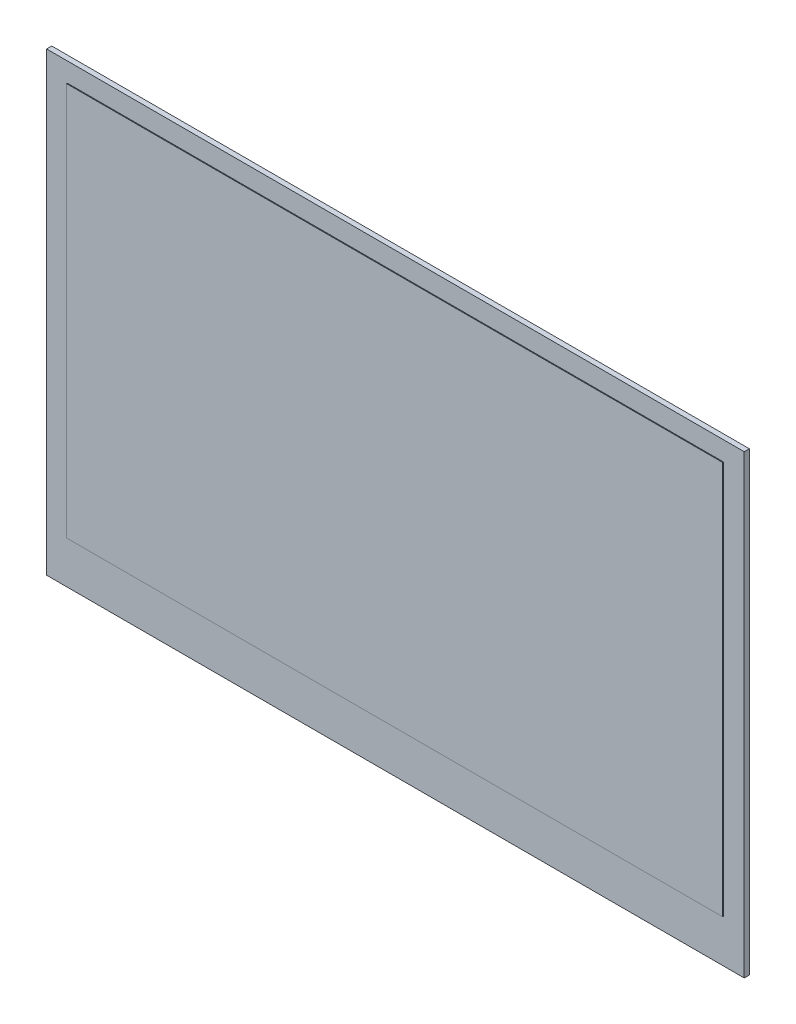
ISO-10303-21;
HEADER;
FILE_DESCRIPTION(('STEP AP214'),'2;1');
FILE_NAME('part.step','',(''),(''),'','','');
FILE_SCHEMA(('AUTOMOTIVE_DESIGN { 1 0 10303 214 1 1 1 1 }'));
ENDSEC;
DATA;
#1=APPLICATION_CONTEXT('core data for automotive mechanical design processes');
#2=APPLICATION_PROTOCOL_DEFINITION('international standard','automotive_design',2000,#1);
#3=PRODUCT_CONTEXT('',#1,'mechanical');
#4=PRODUCT('Part','Part','',(#3));
#5=PRODUCT_RELATED_PRODUCT_CATEGORY('part','',(#4));
#6=PRODUCT_DEFINITION_FORMATION('','',#4);
#7=PRODUCT_DEFINITION_CONTEXT('part definition',#1,'design');
#8=PRODUCT_DEFINITION('design','',#6,#7);
#9=PRODUCT_DEFINITION_SHAPE('','',#8);
#10=(LENGTH_UNIT() NAMED_UNIT(*) SI_UNIT(.MILLI.,.METRE.));
#11=(NAMED_UNIT(*) PLANE_ANGLE_UNIT() SI_UNIT($,.RADIAN.));
#12=(NAMED_UNIT(*) SI_UNIT($,.STERADIAN.) SOLID_ANGLE_UNIT());
#13=UNCERTAINTY_MEASURE_WITH_UNIT(LENGTH_MEASURE(1.E-05),#10,'distance_accuracy_value','');
#14=(GEOMETRIC_REPRESENTATION_CONTEXT(3) GLOBAL_UNCERTAINTY_ASSIGNED_CONTEXT((#13)) GLOBAL_UNIT_ASSIGNED_CONTEXT((#10,
#11,#12)) REPRESENTATION_CONTEXT('',''));
#15=CARTESIAN_POINT('',(0.,0.,0.));
#16=DIRECTION('',(0.,0.,1.));
#17=DIRECTION('',(1.,0.,0.));
#18=AXIS2_PLACEMENT_3D('',#15,#16,#17);
#19=CARTESIAN_POINT('',(85.1,55.6,1.25));
#20=DIRECTION('',(-1.,0.,0.));
#21=DIRECTION('',(0.,0.,1.));
#22=AXIS2_PLACEMENT_3D('',#19,#20,#21);
#23=PLANE('',#22);
#24=DIRECTION('',(0.,1.,0.));
#25=VECTOR('',#24,1.);
#26=CARTESIAN_POINT('',(85.1,55.6,0.));
#27=LINE('',#26,#25);
#28=CARTESIAN_POINT('',(85.1,-55.6,0.));
#29=VERTEX_POINT('',#28);
#30=CARTESIAN_POINT('',(85.1,55.6,0.));
#31=VERTEX_POINT('',#30);
#32=EDGE_CURVE('E122',#29,#31,#27,.T.);
#33=ORIENTED_EDGE('',*,*,#32,.T.);
#34=DIRECTION('',(0.,0.,-1.));
#35=VECTOR('',#34,1.);
#36=CARTESIAN_POINT('',(85.1,55.6,1.25));
#37=LINE('',#36,#35);
#38=CARTESIAN_POINT('',(85.1,55.6,1.25));
#39=VERTEX_POINT('',#38);
#40=EDGE_CURVE('E11',#39,#31,#37,.T.);
#41=ORIENTED_EDGE('',*,*,#40,.F.);
#42=DIRECTION('',(0.,1.,0.));
#43=VECTOR('',#42,1.);
#44=CARTESIAN_POINT('',(85.1,55.6,1.25));
#45=LINE('',#44,#43);
#46=CARTESIAN_POINT('',(85.1,-55.6,1.25));
#47=VERTEX_POINT('',#46);
#48=EDGE_CURVE('E131',#47,#39,#45,.T.);
#49=ORIENTED_EDGE('',*,*,#48,.F.);
#50=DIRECTION('',(0.,0.,-1.));
#51=VECTOR('',#50,1.);
#52=CARTESIAN_POINT('',(85.1,-55.6,1.25));
#53=LINE('',#52,#51);
#54=EDGE_CURVE('E140',#47,#29,#53,.T.);
#55=ORIENTED_EDGE('',*,*,#54,.T.);
#56=EDGE_LOOP('',(#33,#41,#49,#55));
#57=FACE_BOUND('',#56,.T.);
#58=ADVANCED_FACE('F38',(#57),#23,.F.);
#59=CARTESIAN_POINT('',(-85.1,55.6,1.25));
#60=DIRECTION('',(0.,-1.,0.));
#61=DIRECTION('',(0.,0.,-1.));
#62=AXIS2_PLACEMENT_3D('',#59,#60,#61);
#63=PLANE('',#62);
#64=DIRECTION('',(-1.,0.,0.));
#65=VECTOR('',#64,1.);
#66=CARTESIAN_POINT('',(-85.1,55.6,0.));
#67=LINE('',#66,#65);
#68=CARTESIAN_POINT('',(-85.1,55.6,0.));
#69=VERTEX_POINT('',#68);
#70=EDGE_CURVE('E125',#31,#69,#67,.T.);
#71=ORIENTED_EDGE('',*,*,#70,.T.);
#72=DIRECTION('',(0.,0.,-1.));
#73=VECTOR('',#72,1.);
#74=CARTESIAN_POINT('',(-85.1,55.6,1.25));
#75=LINE('',#74,#73);
#76=CARTESIAN_POINT('',(-85.1,55.6,1.25));
#77=VERTEX_POINT('',#76);
#78=EDGE_CURVE('E45',#77,#69,#75,.T.);
#79=ORIENTED_EDGE('',*,*,#78,.F.);
#80=DIRECTION('',(-1.,0.,0.));
#81=VECTOR('',#80,1.);
#82=CARTESIAN_POINT('',(-85.1,55.6,1.25));
#83=LINE('',#82,#81);
#84=EDGE_CURVE('E134',#39,#77,#83,.T.);
#85=ORIENTED_EDGE('',*,*,#84,.F.);
#86=ORIENTED_EDGE('',*,*,#40,.T.);
#87=EDGE_LOOP('',(#71,#79,#85,#86));
#88=FACE_BOUND('',#87,.T.);
#89=ADVANCED_FACE('F171',(#88),#63,.F.);
#90=CARTESIAN_POINT('',(-85.1,55.6,1.25));
#91=DIRECTION('',(1.,0.,0.));
#92=DIRECTION('',(0.,1.,0.));
#93=AXIS2_PLACEMENT_3D('',#90,#91,#92);
#94=PLANE('',#93);
#95=DIRECTION('',(0.,-1.,0.));
#96=VECTOR('',#95,1.);
#97=CARTESIAN_POINT('',(-85.1,55.6,0.));
#98=LINE('',#97,#96);
#99=CARTESIAN_POINT('',(-85.1,-55.6,0.));
#100=VERTEX_POINT('',#99);
#101=EDGE_CURVE('E143',#69,#100,#98,.T.);
#102=ORIENTED_EDGE('',*,*,#101,.T.);
#103=DIRECTION('',(0.,0.,-1.));
#104=VECTOR('',#103,1.);
#105=CARTESIAN_POINT('',(-85.1,-55.6,1.25));
#106=LINE('',#105,#104);
#107=CARTESIAN_POINT('',(-85.1,-55.6,1.25));
#108=VERTEX_POINT('',#107);
#109=EDGE_CURVE('E148',#108,#100,#106,.T.);
#110=ORIENTED_EDGE('',*,*,#109,.F.);
#111=DIRECTION('',(0.,-1.,0.));
#112=VECTOR('',#111,1.);
#113=CARTESIAN_POINT('',(-85.1,55.6,1.25));
#114=LINE('',#113,#112);
#115=EDGE_CURVE('E137',#77,#108,#114,.T.);
#116=ORIENTED_EDGE('',*,*,#115,.F.);
#117=ORIENTED_EDGE('',*,*,#78,.T.);
#118=EDGE_LOOP('',(#102,#110,#116,#117));
#119=FACE_BOUND('',#118,.T.);
#120=ADVANCED_FACE('F155',(#119),#94,.F.);
#121=CARTESIAN_POINT('',(-85.1,-55.6,1.25));
#122=DIRECTION('',(0.,1.,0.));
#123=DIRECTION('',(0.,0.,1.));
#124=AXIS2_PLACEMENT_3D('',#121,#122,#123);
#125=PLANE('',#124);
#126=DIRECTION('',(1.,0.,0.));
#127=VECTOR('',#126,1.);
#128=CARTESIAN_POINT('',(-85.1,-55.6,0.));
#129=LINE('',#128,#127);
#130=EDGE_CURVE('E135',#100,#29,#129,.T.);
#131=ORIENTED_EDGE('',*,*,#130,.T.);
#132=ORIENTED_EDGE('',*,*,#54,.F.);
#133=DIRECTION('',(1.,0.,0.));
#134=VECTOR('',#133,1.);
#135=CARTESIAN_POINT('',(-85.1,-55.6,1.25));
#136=LINE('',#135,#134);
#137=EDGE_CURVE('E139',#108,#47,#136,.T.);
#138=ORIENTED_EDGE('',*,*,#137,.F.);
#139=ORIENTED_EDGE('',*,*,#109,.T.);
#140=EDGE_LOOP('',(#131,#132,#138,#139));
#141=FACE_BOUND('',#140,.T.);
#142=ADVANCED_FACE('F164',(#141),#125,.F.);
#143=CARTESIAN_POINT('',(0.,0.,1.25));
#144=DIRECTION('',(0.,0.,1.));
#145=DIRECTION('',(1.,0.,0.));
#146=AXIS2_PLACEMENT_3D('',#143,#144,#145);
#147=PLANE('',#146);
#148=DIRECTION('',(0.,1.,0.));
#149=VECTOR('',#148,1.);
#150=CARTESIAN_POINT('',(80.,50.9,1.25));
#151=LINE('',#150,#149);
#152=CARTESIAN_POINT('',(80.,-45.1,1.25));
#153=VERTEX_POINT('',#152);
#154=CARTESIAN_POINT('',(80.,50.9,1.25));
#155=VERTEX_POINT('',#154);
#156=EDGE_CURVE('E52',#153,#155,#151,.T.);
#157=ORIENTED_EDGE('',*,*,#156,.F.);
#158=DIRECTION('',(1.,0.,0.));
#159=VECTOR('',#158,1.);
#160=CARTESIAN_POINT('',(-80.,-45.1,1.25));
#161=LINE('',#160,#159);
#162=CARTESIAN_POINT('',(-80.,-45.1,1.25));
#163=VERTEX_POINT('',#162);
#164=EDGE_CURVE('E56',#163,#153,#161,.T.);
#165=ORIENTED_EDGE('',*,*,#164,.F.);
#166=DIRECTION('',(0.,-1.,0.));
#167=VECTOR('',#166,1.);
#168=CARTESIAN_POINT('',(-80.,50.9,1.25));
#169=LINE('',#168,#167);
#170=CARTESIAN_POINT('',(-80.,50.9,1.25));
#171=VERTEX_POINT('',#170);
#172=EDGE_CURVE('E267',#171,#163,#169,.T.);
#173=ORIENTED_EDGE('',*,*,#172,.F.);
#174=DIRECTION('',(-1.,0.,0.));
#175=VECTOR('',#174,1.);
#176=CARTESIAN_POINT('',(-80.,50.9,1.25));
#177=LINE('',#176,#175);
#178=EDGE_CURVE('E273',#155,#171,#177,.T.);
#179=ORIENTED_EDGE('',*,*,#178,.F.);
#180=EDGE_LOOP('',(#157,#165,#173,#179));
#181=FACE_BOUND('',#180,.T.);
#182=ORIENTED_EDGE('',*,*,#48,.T.);
#183=ORIENTED_EDGE('',*,*,#84,.T.);
#184=ORIENTED_EDGE('',*,*,#115,.T.);
#185=ORIENTED_EDGE('',*,*,#137,.T.);
#186=EDGE_LOOP('',(#182,#183,#184,#185));
#187=FACE_BOUND('',#186,.T.);
#188=ADVANCED_FACE('F170',(#181,#187),#147,.T.);
#189=CARTESIAN_POINT('',(0.,0.,0.));
#190=DIRECTION('',(0.,0.,1.));
#191=DIRECTION('',(1.,0.,0.));
#192=AXIS2_PLACEMENT_3D('',#189,#190,#191);
#193=PLANE('',#192);
#194=ORIENTED_EDGE('',*,*,#32,.F.);
#195=ORIENTED_EDGE('',*,*,#130,.F.);
#196=ORIENTED_EDGE('',*,*,#101,.F.);
#197=ORIENTED_EDGE('',*,*,#70,.F.);
#198=EDGE_LOOP('',(#194,#195,#196,#197));
#199=FACE_BOUND('',#198,.T.);
#200=ADVANCED_FACE('F161',(#199),#193,.F.);
#201=CARTESIAN_POINT('',(80.,50.9,1.45));
#202=DIRECTION('',(-1.,0.,0.));
#203=DIRECTION('',(0.,-1.,0.));
#204=AXIS2_PLACEMENT_3D('',#201,#202,#203);
#205=PLANE('',#204);
#206=ORIENTED_EDGE('',*,*,#156,.T.);
#207=DIRECTION('',(0.,0.,-1.));
#208=VECTOR('',#207,1.);
#209=CARTESIAN_POINT('',(80.,50.9,1.45));
#210=LINE('',#209,#208);
#211=CARTESIAN_POINT('',(80.,50.9,1.45));
#212=VERTEX_POINT('',#211);
#213=EDGE_CURVE('E105',#212,#155,#210,.T.);
#214=ORIENTED_EDGE('',*,*,#213,.F.);
#215=DIRECTION('',(0.,1.,0.));
#216=VECTOR('',#215,1.);
#217=CARTESIAN_POINT('',(80.,50.9,1.45));
#218=LINE('',#217,#216);
#219=CARTESIAN_POINT('',(80.,-45.1,1.45));
#220=VERTEX_POINT('',#219);
#221=EDGE_CURVE('E111',#220,#212,#218,.T.);
#222=ORIENTED_EDGE('',*,*,#221,.F.);
#223=DIRECTION('',(0.,0.,-1.));
#224=VECTOR('',#223,1.);
#225=CARTESIAN_POINT('',(80.,-45.1,1.45));
#226=LINE('',#225,#224);
#227=EDGE_CURVE('E265',#220,#153,#226,.T.);
#228=ORIENTED_EDGE('',*,*,#227,.T.);
#229=EDGE_LOOP('',(#206,#214,#222,#228));
#230=FACE_BOUND('',#229,.T.);
#231=ADVANCED_FACE('F121',(#230),#205,.F.);
#232=CARTESIAN_POINT('',(-80.,50.9,1.45));
#233=DIRECTION('',(0.,-1.,0.));
#234=DIRECTION('',(1.,0.,0.));
#235=AXIS2_PLACEMENT_3D('',#232,#233,#234);
#236=PLANE('',#235);
#237=ORIENTED_EDGE('',*,*,#178,.T.);
#238=DIRECTION('',(0.,0.,-1.));
#239=VECTOR('',#238,1.);
#240=CARTESIAN_POINT('',(-80.,50.9,1.45));
#241=LINE('',#240,#239);
#242=CARTESIAN_POINT('',(-80.,50.9,1.45));
#243=VERTEX_POINT('',#242);
#244=EDGE_CURVE('E107',#243,#171,#241,.T.);
#245=ORIENTED_EDGE('',*,*,#244,.F.);
#246=DIRECTION('',(-1.,0.,0.));
#247=VECTOR('',#246,1.);
#248=CARTESIAN_POINT('',(-80.,50.9,1.45));
#249=LINE('',#248,#247);
#250=EDGE_CURVE('E100',#212,#243,#249,.T.);
#251=ORIENTED_EDGE('',*,*,#250,.F.);
#252=ORIENTED_EDGE('',*,*,#213,.T.);
#253=EDGE_LOOP('',(#237,#245,#251,#252));
#254=FACE_BOUND('',#253,.T.);
#255=ADVANCED_FACE('F103',(#254),#236,.F.);
#256=CARTESIAN_POINT('',(-80.,50.9,1.45));
#257=DIRECTION('',(1.,0.,0.));
#258=DIRECTION('',(0.,1.,0.));
#259=AXIS2_PLACEMENT_3D('',#256,#257,#258);
#260=PLANE('',#259);
#261=ORIENTED_EDGE('',*,*,#172,.T.);
#262=DIRECTION('',(0.,0.,-1.));
#263=VECTOR('',#262,1.);
#264=CARTESIAN_POINT('',(-80.,-45.1,1.45));
#265=LINE('',#264,#263);
#266=CARTESIAN_POINT('',(-80.,-45.1,1.45));
#267=VERTEX_POINT('',#266);
#268=EDGE_CURVE('E127',#267,#163,#265,.T.);
#269=ORIENTED_EDGE('',*,*,#268,.F.);
#270=DIRECTION('',(0.,-1.,0.));
#271=VECTOR('',#270,1.);
#272=CARTESIAN_POINT('',(-80.,50.9,1.45));
#273=LINE('',#272,#271);
#274=EDGE_CURVE('E110',#243,#267,#273,.T.);
#275=ORIENTED_EDGE('',*,*,#274,.F.);
#276=ORIENTED_EDGE('',*,*,#244,.T.);
#277=EDGE_LOOP('',(#261,#269,#275,#276));
#278=FACE_BOUND('',#277,.T.);
#279=ADVANCED_FACE('F189',(#278),#260,.F.);
#280=CARTESIAN_POINT('',(-80.,-45.1,1.45));
#281=DIRECTION('',(0.,1.,0.));
#282=DIRECTION('',(-1.,0.,0.));
#283=AXIS2_PLACEMENT_3D('',#280,#281,#282);
#284=PLANE('',#283);
#285=ORIENTED_EDGE('',*,*,#164,.T.);
#286=ORIENTED_EDGE('',*,*,#227,.F.);
#287=DIRECTION('',(1.,0.,0.));
#288=VECTOR('',#287,1.);
#289=CARTESIAN_POINT('',(-80.,-45.1,1.45));
#290=LINE('',#289,#288);
#291=EDGE_CURVE('E116',#267,#220,#290,.T.);
#292=ORIENTED_EDGE('',*,*,#291,.F.);
#293=ORIENTED_EDGE('',*,*,#268,.T.);
#294=EDGE_LOOP('',(#285,#286,#292,#293));
#295=FACE_BOUND('',#294,.T.);
#296=ADVANCED_FACE('F192',(#295),#284,.F.);
#297=CARTESIAN_POINT('',(0.,0.,1.45));
#298=DIRECTION('',(0.,0.,1.));
#299=DIRECTION('',(1.,0.,0.));
#300=AXIS2_PLACEMENT_3D('',#297,#298,#299);
#301=PLANE('',#300);
#302=ORIENTED_EDGE('',*,*,#221,.T.);
#303=ORIENTED_EDGE('',*,*,#250,.T.);
#304=ORIENTED_EDGE('',*,*,#274,.T.);
#305=ORIENTED_EDGE('',*,*,#291,.T.);
#306=EDGE_LOOP('',(#302,#303,#304,#305));
#307=FACE_BOUND('',#306,.T.);
#308=ADVANCED_FACE('F114',(#307),#301,.T.);
#309=CLOSED_SHELL('',(#58,#89,#120,#142,#188,#200,#231,#255,#279,#296,#308));
#310=MANIFOLD_SOLID_BREP('B2',#309);
#311=ADVANCED_BREP_SHAPE_REPRESENTATION('',(#18,#310),#14);
#312=SHAPE_DEFINITION_REPRESENTATION(#9,#311);
ENDSEC;
END-ISO-10303-21;
